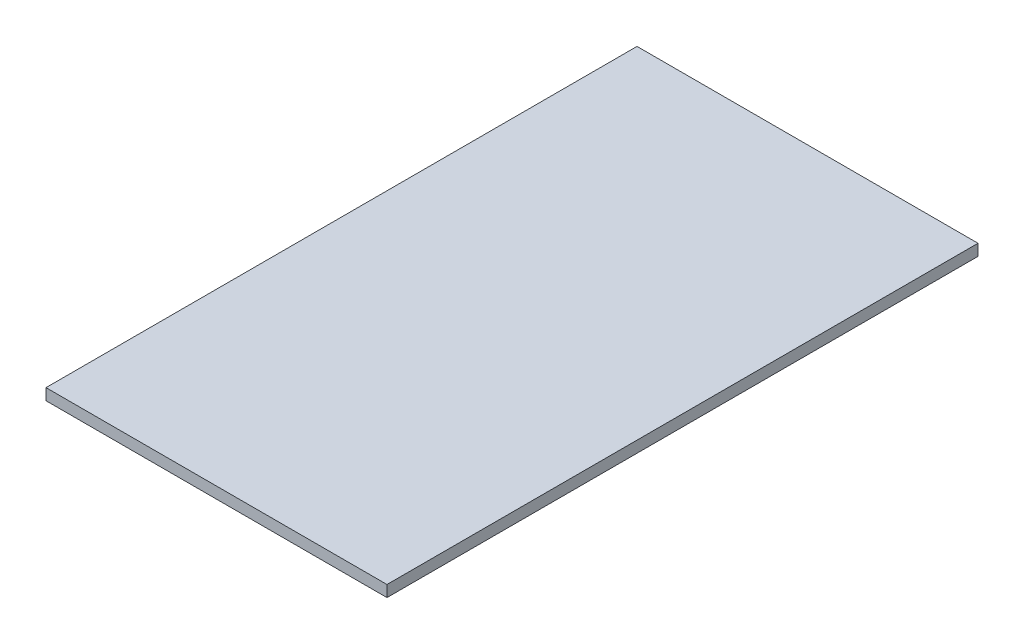
ISO-10303-21;
HEADER;
FILE_DESCRIPTION(('STEP AP214'),'2;1');
FILE_NAME('part.step','',(''),(''),'','','');
FILE_SCHEMA(('AUTOMOTIVE_DESIGN { 1 0 10303 214 1 1 1 1 }'));
ENDSEC;
DATA;
#1=APPLICATION_CONTEXT('core data for automotive mechanical design processes');
#2=APPLICATION_PROTOCOL_DEFINITION('international standard','automotive_design',2000,#1);
#3=PRODUCT_CONTEXT('',#1,'mechanical');
#4=PRODUCT('Part','Part','',(#3));
#5=PRODUCT_RELATED_PRODUCT_CATEGORY('part','',(#4));
#6=PRODUCT_DEFINITION_FORMATION('','',#4);
#7=PRODUCT_DEFINITION_CONTEXT('part definition',#1,'design');
#8=PRODUCT_DEFINITION('design','',#6,#7);
#9=PRODUCT_DEFINITION_SHAPE('','',#8);
#10=(LENGTH_UNIT() NAMED_UNIT(*) SI_UNIT(.MILLI.,.METRE.));
#11=(NAMED_UNIT(*) PLANE_ANGLE_UNIT() SI_UNIT($,.RADIAN.));
#12=(NAMED_UNIT(*) SI_UNIT($,.STERADIAN.) SOLID_ANGLE_UNIT());
#13=UNCERTAINTY_MEASURE_WITH_UNIT(LENGTH_MEASURE(1.E-05),#10,'distance_accuracy_value','');
#14=(GEOMETRIC_REPRESENTATION_CONTEXT(3) GLOBAL_UNCERTAINTY_ASSIGNED_CONTEXT((#13)) GLOBAL_UNIT_ASSIGNED_CONTEXT((#10,
#11,#12)) REPRESENTATION_CONTEXT('',''));
#15=CARTESIAN_POINT('',(0.,0.,0.));
#16=DIRECTION('',(0.,0.,1.));
#17=DIRECTION('',(1.,0.,0.));
#18=AXIS2_PLACEMENT_3D('',#15,#16,#17);
#19=CARTESIAN_POINT('',(-30.3006056019863,19.1433263689146,338.433128803222));
#20=DIRECTION('',(-1.,0.,0.));
#21=DIRECTION('',(0.,0.,1.));
#22=AXIS2_PLACEMENT_3D('',#19,#20,#21);
#23=PLANE('',#22);
#24=DIRECTION('',(0.,0.,1.));
#25=VECTOR('',#24,1.);
#26=CARTESIAN_POINT('',(-30.3006056019863,29.1433263689146,338.433128803222));
#27=LINE('',#26,#25);
#28=CARTESIAN_POINT('',(-30.3006056019862,29.1433263689146,-181.566871196778));
#29=VERTEX_POINT('',#28);
#30=CARTESIAN_POINT('',(-30.3006056019863,29.1433263689146,338.433128803222));
#31=VERTEX_POINT('',#30);
#32=EDGE_CURVE('E95',#29,#31,#27,.T.);
#33=ORIENTED_EDGE('',*,*,#32,.T.);
#34=DIRECTION('',(0.,1.,0.));
#35=VECTOR('',#34,1.);
#36=CARTESIAN_POINT('',(-30.3006056019863,19.1433263689146,338.433128803222));
#37=LINE('',#36,#35);
#38=CARTESIAN_POINT('',(-30.3006056019863,19.1433263689146,338.433128803222));
#39=VERTEX_POINT('',#38);
#40=EDGE_CURVE('E11',#39,#31,#37,.T.);
#41=ORIENTED_EDGE('',*,*,#40,.F.);
#42=DIRECTION('',(0.,0.,1.));
#43=VECTOR('',#42,1.);
#44=CARTESIAN_POINT('',(-30.3006056019863,19.1433263689146,338.433128803222));
#45=LINE('',#44,#43);
#46=CARTESIAN_POINT('',(-30.3006056019862,19.1433263689146,-181.566871196778));
#47=VERTEX_POINT('',#46);
#48=EDGE_CURVE('E83',#47,#39,#45,.T.);
#49=ORIENTED_EDGE('',*,*,#48,.F.);
#50=DIRECTION('',(0.,1.,0.));
#51=VECTOR('',#50,1.);
#52=CARTESIAN_POINT('',(-30.3006056019862,19.1433263689146,-181.566871196778));
#53=LINE('',#52,#51);
#54=EDGE_CURVE('E91',#47,#29,#53,.T.);
#55=ORIENTED_EDGE('',*,*,#54,.T.);
#56=EDGE_LOOP('',(#33,#41,#49,#55));
#57=FACE_BOUND('',#56,.T.);
#58=ADVANCED_FACE('F32',(#57),#23,.F.);
#59=CARTESIAN_POINT('',(-30.3006056019863,19.1433263689146,338.433128803222));
#60=DIRECTION('',(0.,0.,-1.));
#61=DIRECTION('',(-1.,0.,0.));
#62=AXIS2_PLACEMENT_3D('',#59,#60,#61);
#63=PLANE('',#62);
#64=DIRECTION('',(-1.,0.,0.));
#65=VECTOR('',#64,1.);
#66=CARTESIAN_POINT('',(-30.3006056019863,29.1433263689146,338.433128803222));
#67=LINE('',#66,#65);
#68=CARTESIAN_POINT('',(-330.300605601986,29.1433263689146,338.433128803221));
#69=VERTEX_POINT('',#68);
#70=EDGE_CURVE('E87',#31,#69,#67,.T.);
#71=ORIENTED_EDGE('',*,*,#70,.T.);
#72=DIRECTION('',(0.,1.,0.));
#73=VECTOR('',#72,1.);
#74=CARTESIAN_POINT('',(-330.300605601986,19.1433263689146,338.433128803221));
#75=LINE('',#74,#73);
#76=CARTESIAN_POINT('',(-330.300605601986,19.1433263689146,338.433128803221));
#77=VERTEX_POINT('',#76);
#78=EDGE_CURVE('E40',#77,#69,#75,.T.);
#79=ORIENTED_EDGE('',*,*,#78,.F.);
#80=DIRECTION('',(-1.,0.,0.));
#81=VECTOR('',#80,1.);
#82=CARTESIAN_POINT('',(-30.3006056019863,19.1433263689146,338.433128803222));
#83=LINE('',#82,#81);
#84=EDGE_CURVE('E78',#39,#77,#83,.T.);
#85=ORIENTED_EDGE('',*,*,#84,.F.);
#86=ORIENTED_EDGE('',*,*,#40,.T.);
#87=EDGE_LOOP('',(#71,#79,#85,#86));
#88=FACE_BOUND('',#87,.T.);
#89=ADVANCED_FACE('F86',(#88),#63,.F.);
#90=CARTESIAN_POINT('',(-330.300605601986,19.1433263689146,338.433128803221));
#91=DIRECTION('',(1.,0.,0.));
#92=DIRECTION('',(0.,0.,-1.));
#93=AXIS2_PLACEMENT_3D('',#90,#91,#92);
#94=PLANE('',#93);
#95=DIRECTION('',(0.,0.,-1.));
#96=VECTOR('',#95,1.);
#97=CARTESIAN_POINT('',(-330.300605601986,29.1433263689146,338.433128803221));
#98=LINE('',#97,#96);
#99=CARTESIAN_POINT('',(-330.300605601986,29.1433263689146,-181.566871196778));
#100=VERTEX_POINT('',#99);
#101=EDGE_CURVE('E65',#69,#100,#98,.T.);
#102=ORIENTED_EDGE('',*,*,#101,.T.);
#103=DIRECTION('',(0.,1.,0.));
#104=VECTOR('',#103,1.);
#105=CARTESIAN_POINT('',(-330.300605601986,19.1433263689146,-181.566871196778));
#106=LINE('',#105,#104);
#107=CARTESIAN_POINT('',(-330.300605601986,19.1433263689146,-181.566871196778));
#108=VERTEX_POINT('',#107);
#109=EDGE_CURVE('E88',#108,#100,#106,.T.);
#110=ORIENTED_EDGE('',*,*,#109,.F.);
#111=DIRECTION('',(0.,0.,-1.));
#112=VECTOR('',#111,1.);
#113=CARTESIAN_POINT('',(-330.300605601986,19.1433263689146,338.433128803221));
#114=LINE('',#113,#112);
#115=EDGE_CURVE('E81',#77,#108,#114,.T.);
#116=ORIENTED_EDGE('',*,*,#115,.F.);
#117=ORIENTED_EDGE('',*,*,#78,.T.);
#118=EDGE_LOOP('',(#102,#110,#116,#117));
#119=FACE_BOUND('',#118,.T.);
#120=ADVANCED_FACE('F89',(#119),#94,.F.);
#121=CARTESIAN_POINT('',(-30.3006056019862,19.1433263689146,-181.566871196778));
#122=DIRECTION('',(0.,0.,1.));
#123=DIRECTION('',(1.,0.,0.));
#124=AXIS2_PLACEMENT_3D('',#121,#122,#123);
#125=PLANE('',#124);
#126=DIRECTION('',(1.,0.,0.));
#127=VECTOR('',#126,1.);
#128=CARTESIAN_POINT('',(-30.3006056019862,29.1433263689146,-181.566871196778));
#129=LINE('',#128,#127);
#130=EDGE_CURVE('E71',#100,#29,#129,.T.);
#131=ORIENTED_EDGE('',*,*,#130,.T.);
#132=ORIENTED_EDGE('',*,*,#54,.F.);
#133=DIRECTION('',(1.,0.,0.));
#134=VECTOR('',#133,1.);
#135=CARTESIAN_POINT('',(-30.3006056019862,19.1433263689146,-181.566871196778));
#136=LINE('',#135,#134);
#137=EDGE_CURVE('E48',#108,#47,#136,.T.);
#138=ORIENTED_EDGE('',*,*,#137,.F.);
#139=ORIENTED_EDGE('',*,*,#109,.T.);
#140=EDGE_LOOP('',(#131,#132,#138,#139));
#141=FACE_BOUND('',#140,.T.);
#142=ADVANCED_FACE('F102',(#141),#125,.F.);
#143=CARTESIAN_POINT('',(0.,19.1433263689146,0.));
#144=DIRECTION('',(0.,1.,0.));
#145=DIRECTION('',(0.,0.,1.));
#146=AXIS2_PLACEMENT_3D('',#143,#144,#145);
#147=PLANE('',#146);
#148=ORIENTED_EDGE('',*,*,#48,.T.);
#149=ORIENTED_EDGE('',*,*,#84,.T.);
#150=ORIENTED_EDGE('',*,*,#115,.T.);
#151=ORIENTED_EDGE('',*,*,#137,.T.);
#152=EDGE_LOOP('',(#148,#149,#150,#151));
#153=FACE_BOUND('',#152,.T.);
#154=ADVANCED_FACE('F79',(#153),#147,.F.);
#155=CARTESIAN_POINT('',(0.,29.1433263689146,0.));
#156=DIRECTION('',(0.,1.,0.));
#157=DIRECTION('',(0.,0.,1.));
#158=AXIS2_PLACEMENT_3D('',#155,#156,#157);
#159=PLANE('',#158);
#160=ORIENTED_EDGE('',*,*,#32,.F.);
#161=ORIENTED_EDGE('',*,*,#130,.F.);
#162=ORIENTED_EDGE('',*,*,#101,.F.);
#163=ORIENTED_EDGE('',*,*,#70,.F.);
#164=EDGE_LOOP('',(#160,#161,#162,#163));
#165=FACE_BOUND('',#164,.T.);
#166=ADVANCED_FACE('F105',(#165),#159,.T.);
#167=CLOSED_SHELL('',(#58,#89,#120,#142,#154,#166));
#168=MANIFOLD_SOLID_BREP('B2',#167);
#169=ADVANCED_BREP_SHAPE_REPRESENTATION('',(#18,#168),#14);
#170=SHAPE_DEFINITION_REPRESENTATION(#9,#169);
ENDSEC;
END-ISO-10303-21;
